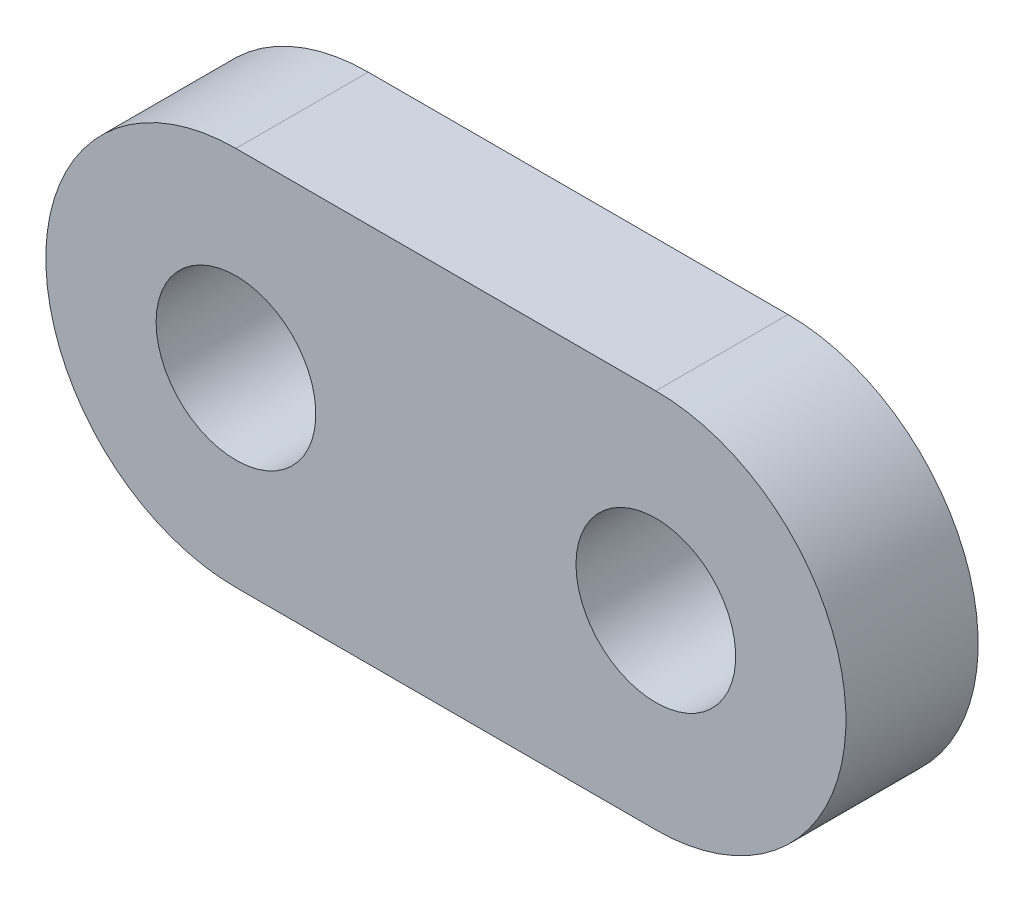
ISO-10303-21;
HEADER;
FILE_DESCRIPTION(('STEP AP214'),'2;1');
FILE_NAME('part.step','',(''),(''),'','','');
FILE_SCHEMA(('AUTOMOTIVE_DESIGN { 1 0 10303 214 1 1 1 1 }'));
ENDSEC;
DATA;
#1=APPLICATION_CONTEXT('core data for automotive mechanical design processes');
#2=APPLICATION_PROTOCOL_DEFINITION('international standard','automotive_design',2000,#1);
#3=PRODUCT_CONTEXT('',#1,'mechanical');
#4=PRODUCT('Part','Part','',(#3));
#5=PRODUCT_RELATED_PRODUCT_CATEGORY('part','',(#4));
#6=PRODUCT_DEFINITION_FORMATION('','',#4);
#7=PRODUCT_DEFINITION_CONTEXT('part definition',#1,'design');
#8=PRODUCT_DEFINITION('design','',#6,#7);
#9=PRODUCT_DEFINITION_SHAPE('','',#8);
#10=(LENGTH_UNIT() NAMED_UNIT(*) SI_UNIT(.MILLI.,.METRE.));
#11=(NAMED_UNIT(*) PLANE_ANGLE_UNIT() SI_UNIT($,.RADIAN.));
#12=(NAMED_UNIT(*) SI_UNIT($,.STERADIAN.) SOLID_ANGLE_UNIT());
#13=UNCERTAINTY_MEASURE_WITH_UNIT(LENGTH_MEASURE(1.E-05),#10,'distance_accuracy_value','');
#14=(GEOMETRIC_REPRESENTATION_CONTEXT(3) GLOBAL_UNCERTAINTY_ASSIGNED_CONTEXT((#13)) GLOBAL_UNIT_ASSIGNED_CONTEXT((#10,
#11,#12)) REPRESENTATION_CONTEXT('',''));
#15=CARTESIAN_POINT('',(0.,0.,0.));
#16=DIRECTION('',(0.,0.,1.));
#17=DIRECTION('',(1.,0.,0.));
#18=AXIS2_PLACEMENT_3D('',#15,#16,#17);
#19=CARTESIAN_POINT('',(-12.7,-5.75,0.));
#20=DIRECTION('',(0.,1.,0.));
#21=DIRECTION('',(0.,0.,1.));
#22=AXIS2_PLACEMENT_3D('',#19,#20,#21);
#23=PLANE('',#22);
#24=DIRECTION('',(0.,0.,-1.));
#25=VECTOR('',#24,1.);
#26=CARTESIAN_POINT('',(2.21196633386767E-09,-5.75,2.));
#27=LINE('',#26,#25);
#28=CARTESIAN_POINT('',(1.10598326369185E-09,-5.75,0.));
#29=VERTEX_POINT('',#28);
#30=CARTESIAN_POINT('',(1.10598326369185E-09,-5.75,4.));
#31=VERTEX_POINT('',#30);
#32=EDGE_CURVE('E83',#29,#31,#27,.F.);
#33=ORIENTED_EDGE('',*,*,#32,.T.);
#34=DIRECTION('',(1.,0.,0.));
#35=VECTOR('',#34,1.);
#36=CARTESIAN_POINT('',(-6.35,-5.75,4.));
#37=LINE('',#36,#35);
#38=CARTESIAN_POINT('',(-12.7,-5.75,4.));
#39=VERTEX_POINT('',#38);
#40=EDGE_CURVE('E59',#39,#31,#37,.T.);
#41=ORIENTED_EDGE('',*,*,#40,.F.);
#42=DIRECTION('',(0.,0.,1.));
#43=VECTOR('',#42,1.);
#44=CARTESIAN_POINT('',(-12.7,-5.75,2.));
#45=LINE('',#44,#43);
#46=CARTESIAN_POINT('',(-12.7,-5.75,0.));
#47=VERTEX_POINT('',#46);
#48=EDGE_CURVE('E57',#47,#39,#45,.T.);
#49=ORIENTED_EDGE('',*,*,#48,.F.);
#50=DIRECTION('',(1.,0.,0.));
#51=VECTOR('',#50,1.);
#52=CARTESIAN_POINT('',(-6.35,-5.75,0.));
#53=LINE('',#52,#51);
#54=EDGE_CURVE('E76',#47,#29,#53,.T.);
#55=ORIENTED_EDGE('',*,*,#54,.T.);
#56=EDGE_LOOP('',(#33,#41,#49,#55));
#57=FACE_BOUND('',#56,.T.);
#58=ADVANCED_FACE('F16',(#57),#23,.F.);
#59=CARTESIAN_POINT('',(0.,0.,4.));
#60=DIRECTION('',(0.,0.,-1.));
#61=DIRECTION('',(-1.,0.,0.));
#62=AXIS2_PLACEMENT_3D('',#59,#60,#61);
#63=CYLINDRICAL_SURFACE('',#62,5.75);
#64=DIRECTION('',(0.,0.,1.));
#65=VECTOR('',#64,1.);
#66=CARTESIAN_POINT('',(0.,5.75,2.));
#67=LINE('',#66,#65);
#68=CARTESIAN_POINT('',(0.,5.75,0.));
#69=VERTEX_POINT('',#68);
#70=CARTESIAN_POINT('',(0.,5.75,4.));
#71=VERTEX_POINT('',#70);
#72=EDGE_CURVE('E67',#69,#71,#67,.T.);
#73=ORIENTED_EDGE('',*,*,#72,.T.);
#74=CARTESIAN_POINT('',(0.,0.,4.));
#75=DIRECTION('',(0.,0.,-1.));
#76=DIRECTION('',(-1.,0.,0.));
#77=AXIS2_PLACEMENT_3D('',#74,#75,#76);
#78=CIRCLE('',#77,5.75);
#79=EDGE_CURVE('E71',#31,#71,#78,.F.);
#80=ORIENTED_EDGE('',*,*,#79,.F.);
#81=ORIENTED_EDGE('',*,*,#32,.F.);
#82=CARTESIAN_POINT('',(0.,0.,0.));
#83=DIRECTION('',(0.,0.,-1.));
#84=DIRECTION('',(-1.,0.,0.));
#85=AXIS2_PLACEMENT_3D('',#82,#83,#84);
#86=CIRCLE('',#85,5.75);
#87=EDGE_CURVE('E94',#29,#69,#86,.F.);
#88=ORIENTED_EDGE('',*,*,#87,.T.);
#89=EDGE_LOOP('',(#73,#80,#81,#88));
#90=FACE_BOUND('',#89,.T.);
#91=ADVANCED_FACE('F128',(#90),#63,.T.);
#92=CARTESIAN_POINT('',(-12.7,5.75,4.));
#93=DIRECTION('',(0.,-1.,0.));
#94=DIRECTION('',(0.,0.,-1.));
#95=AXIS2_PLACEMENT_3D('',#92,#93,#94);
#96=PLANE('',#95);
#97=DIRECTION('',(0.,0.,-1.));
#98=VECTOR('',#97,1.);
#99=CARTESIAN_POINT('',(-12.6999999988207,5.75,2.));
#100=LINE('',#99,#98);
#101=CARTESIAN_POINT('',(-12.6999999994103,5.75,0.));
#102=VERTEX_POINT('',#101);
#103=CARTESIAN_POINT('',(-12.6999999994103,5.75,4.));
#104=VERTEX_POINT('',#103);
#105=EDGE_CURVE('E35',#102,#104,#100,.F.);
#106=ORIENTED_EDGE('',*,*,#105,.T.);
#107=DIRECTION('',(-1.,0.,0.));
#108=VECTOR('',#107,1.);
#109=CARTESIAN_POINT('',(-6.35,5.75,4.));
#110=LINE('',#109,#108);
#111=EDGE_CURVE('E64',#71,#104,#110,.T.);
#112=ORIENTED_EDGE('',*,*,#111,.F.);
#113=ORIENTED_EDGE('',*,*,#72,.F.);
#114=DIRECTION('',(-1.,0.,0.));
#115=VECTOR('',#114,1.);
#116=CARTESIAN_POINT('',(-6.35,5.75,0.));
#117=LINE('',#116,#115);
#118=EDGE_CURVE('E66',#69,#102,#117,.T.);
#119=ORIENTED_EDGE('',*,*,#118,.T.);
#120=EDGE_LOOP('',(#106,#112,#113,#119));
#121=FACE_BOUND('',#120,.T.);
#122=ADVANCED_FACE('F63',(#121),#96,.F.);
#123=CARTESIAN_POINT('',(-12.7,0.,4.));
#124=DIRECTION('',(0.,0.,-1.));
#125=DIRECTION('',(-1.,0.,0.));
#126=AXIS2_PLACEMENT_3D('',#123,#124,#125);
#127=CYLINDRICAL_SURFACE('',#126,5.75);
#128=CARTESIAN_POINT('',(-12.7,0.,4.));
#129=DIRECTION('',(0.,0.,-1.));
#130=DIRECTION('',(-1.,0.,0.));
#131=AXIS2_PLACEMENT_3D('',#128,#129,#130);
#132=CIRCLE('',#131,5.75);
#133=EDGE_CURVE('E20',#104,#39,#132,.F.);
#134=ORIENTED_EDGE('',*,*,#133,.F.);
#135=ORIENTED_EDGE('',*,*,#105,.F.);
#136=CARTESIAN_POINT('',(-12.7,0.,0.));
#137=DIRECTION('',(0.,0.,-1.));
#138=DIRECTION('',(-1.,0.,0.));
#139=AXIS2_PLACEMENT_3D('',#136,#137,#138);
#140=CIRCLE('',#139,5.75);
#141=EDGE_CURVE('E92',#102,#47,#140,.F.);
#142=ORIENTED_EDGE('',*,*,#141,.T.);
#143=ORIENTED_EDGE('',*,*,#48,.T.);
#144=EDGE_LOOP('',(#134,#135,#142,#143));
#145=FACE_BOUND('',#144,.T.);
#146=ADVANCED_FACE('F55',(#145),#127,.T.);
#147=CARTESIAN_POINT('',(0.,0.,4.));
#148=DIRECTION('',(0.,0.,-1.));
#149=DIRECTION('',(-1.,0.,0.));
#150=AXIS2_PLACEMENT_3D('',#147,#148,#149);
#151=CYLINDRICAL_SURFACE('',#150,2.415);
#152=CARTESIAN_POINT('',(0.,0.,0.));
#153=DIRECTION('',(0.,0.,-1.));
#154=DIRECTION('',(-1.,0.,0.));
#155=AXIS2_PLACEMENT_3D('',#152,#153,#154);
#156=CIRCLE('',#155,2.415);
#157=CARTESIAN_POINT('',(-2.415,0.,0.));
#158=VERTEX_POINT('',#157);
#159=EDGE_CURVE('E89',#158,#158,#156,.T.);
#160=ORIENTED_EDGE('',*,*,#159,.T.);
#161=EDGE_LOOP('',(#160));
#162=FACE_BOUND('',#161,.T.);
#163=CARTESIAN_POINT('',(0.,0.,4.));
#164=DIRECTION('',(0.,0.,-1.));
#165=DIRECTION('',(-1.,0.,0.));
#166=AXIS2_PLACEMENT_3D('',#163,#164,#165);
#167=CIRCLE('',#166,2.415);
#168=CARTESIAN_POINT('',(-2.415,0.,4.));
#169=VERTEX_POINT('',#168);
#170=EDGE_CURVE('E73',#169,#169,#167,.T.);
#171=ORIENTED_EDGE('',*,*,#170,.F.);
#172=EDGE_LOOP('',(#171));
#173=FACE_BOUND('',#172,.T.);
#174=ADVANCED_FACE('F112',(#162,#173),#151,.F.);
#175=CARTESIAN_POINT('',(-18.5952,-5.75,4.));
#176=DIRECTION('',(0.,0.,1.));
#177=DIRECTION('',(1.,0.,0.));
#178=AXIS2_PLACEMENT_3D('',#175,#176,#177);
#179=PLANE('',#178);
#180=CARTESIAN_POINT('',(-12.7,0.,4.));
#181=DIRECTION('',(0.,0.,-1.));
#182=DIRECTION('',(-1.,0.,0.));
#183=AXIS2_PLACEMENT_3D('',#180,#181,#182);
#184=CIRCLE('',#183,2.415);
#185=CARTESIAN_POINT('',(-15.115,0.,4.));
#186=VERTEX_POINT('',#185);
#187=EDGE_CURVE('E26',#186,#186,#184,.F.);
#188=ORIENTED_EDGE('',*,*,#187,.F.);
#189=EDGE_LOOP('',(#188));
#190=FACE_BOUND('',#189,.T.);
#191=ORIENTED_EDGE('',*,*,#170,.T.);
#192=EDGE_LOOP('',(#191));
#193=FACE_BOUND('',#192,.T.);
#194=ORIENTED_EDGE('',*,*,#79,.T.);
#195=ORIENTED_EDGE('',*,*,#111,.T.);
#196=ORIENTED_EDGE('',*,*,#133,.T.);
#197=ORIENTED_EDGE('',*,*,#40,.T.);
#198=EDGE_LOOP('',(#194,#195,#196,#197));
#199=FACE_BOUND('',#198,.T.);
#200=ADVANCED_FACE('F69',(#190,#193,#199),#179,.T.);
#201=CARTESIAN_POINT('',(-18.5952,-5.75,0.));
#202=DIRECTION('',(0.,0.,1.));
#203=DIRECTION('',(1.,0.,0.));
#204=AXIS2_PLACEMENT_3D('',#201,#202,#203);
#205=PLANE('',#204);
#206=CARTESIAN_POINT('',(-12.7,0.,0.));
#207=DIRECTION('',(0.,0.,-1.));
#208=DIRECTION('',(-1.,0.,0.));
#209=AXIS2_PLACEMENT_3D('',#206,#207,#208);
#210=CIRCLE('',#209,2.415);
#211=CARTESIAN_POINT('',(-15.115,0.,0.));
#212=VERTEX_POINT('',#211);
#213=EDGE_CURVE('E11',#212,#212,#210,.T.);
#214=ORIENTED_EDGE('',*,*,#213,.F.);
#215=EDGE_LOOP('',(#214));
#216=FACE_BOUND('',#215,.T.);
#217=ORIENTED_EDGE('',*,*,#159,.F.);
#218=EDGE_LOOP('',(#217));
#219=FACE_BOUND('',#218,.T.);
#220=ORIENTED_EDGE('',*,*,#118,.F.);
#221=ORIENTED_EDGE('',*,*,#87,.F.);
#222=ORIENTED_EDGE('',*,*,#54,.F.);
#223=ORIENTED_EDGE('',*,*,#141,.F.);
#224=EDGE_LOOP('',(#220,#221,#222,#223));
#225=FACE_BOUND('',#224,.T.);
#226=ADVANCED_FACE('F18',(#216,#219,#225),#205,.F.);
#227=CARTESIAN_POINT('',(-12.7,0.,4.));
#228=DIRECTION('',(0.,0.,-1.));
#229=DIRECTION('',(-1.,0.,0.));
#230=AXIS2_PLACEMENT_3D('',#227,#228,#229);
#231=CYLINDRICAL_SURFACE('',#230,2.415);
#232=ORIENTED_EDGE('',*,*,#213,.T.);
#233=EDGE_LOOP('',(#232));
#234=FACE_BOUND('',#233,.T.);
#235=ORIENTED_EDGE('',*,*,#187,.T.);
#236=EDGE_LOOP('',(#235));
#237=FACE_BOUND('',#236,.T.);
#238=ADVANCED_FACE('F103',(#234,#237),#231,.F.);
#239=CLOSED_SHELL('',(#58,#91,#122,#146,#174,#200,#226,#238));
#240=MANIFOLD_SOLID_BREP('B1',#239);
#241=ADVANCED_BREP_SHAPE_REPRESENTATION('',(#18,#240),#14);
#242=SHAPE_DEFINITION_REPRESENTATION(#9,#241);
ENDSEC;
END-ISO-10303-21;
